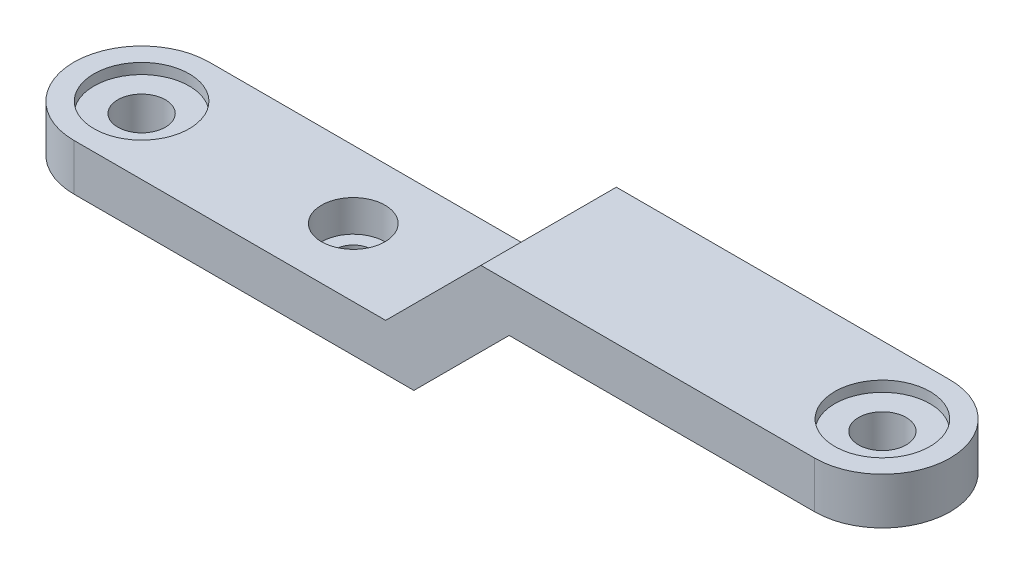
ISO-10303-21;
HEADER;
FILE_DESCRIPTION(('STEP AP214'),'2;1');
FILE_NAME('part.step','',(''),(''),'','','');
FILE_SCHEMA(('AUTOMOTIVE_DESIGN { 1 0 10303 214 1 1 1 1 }'));
ENDSEC;
DATA;
#1=APPLICATION_CONTEXT('core data for automotive mechanical design processes');
#2=APPLICATION_PROTOCOL_DEFINITION('international standard','automotive_design',2000,#1);
#3=PRODUCT_CONTEXT('',#1,'mechanical');
#4=PRODUCT('Part','Part','',(#3));
#5=PRODUCT_RELATED_PRODUCT_CATEGORY('part','',(#4));
#6=PRODUCT_DEFINITION_FORMATION('','',#4);
#7=PRODUCT_DEFINITION_CONTEXT('part definition',#1,'design');
#8=PRODUCT_DEFINITION('design','',#6,#7);
#9=PRODUCT_DEFINITION_SHAPE('','',#8);
#10=(LENGTH_UNIT() NAMED_UNIT(*) SI_UNIT(.MILLI.,.METRE.));
#11=(NAMED_UNIT(*) PLANE_ANGLE_UNIT() SI_UNIT($,.RADIAN.));
#12=(NAMED_UNIT(*) SI_UNIT($,.STERADIAN.) SOLID_ANGLE_UNIT());
#13=UNCERTAINTY_MEASURE_WITH_UNIT(LENGTH_MEASURE(1.E-05),#10,'distance_accuracy_value','');
#14=(GEOMETRIC_REPRESENTATION_CONTEXT(3) GLOBAL_UNCERTAINTY_ASSIGNED_CONTEXT((#13)) GLOBAL_UNIT_ASSIGNED_CONTEXT((#10,
#11,#12)) REPRESENTATION_CONTEXT('',''));
#15=CARTESIAN_POINT('',(0.,0.,0.));
#16=DIRECTION('',(0.,0.,1.));
#17=DIRECTION('',(1.,0.,0.));
#18=AXIS2_PLACEMENT_3D('',#15,#16,#17);
#19=CARTESIAN_POINT('',(6.4,0.,0.));
#20=DIRECTION('',(0.,1.,0.));
#21=DIRECTION('',(-1.,0.,0.));
#22=AXIS2_PLACEMENT_3D('',#19,#20,#21);
#23=CYLINDRICAL_SURFACE('',#22,2.25);
#24=CARTESIAN_POINT('',(6.4,0.,0.));
#25=DIRECTION('',(0.,1.,0.));
#26=DIRECTION('',(-1.,0.,0.));
#27=AXIS2_PLACEMENT_3D('',#24,#25,#26);
#28=CIRCLE('',#27,2.25);
#29=CARTESIAN_POINT('',(4.15,0.,0.));
#30=VERTEX_POINT('',#29);
#31=EDGE_CURVE('E155',#30,#30,#28,.T.);
#32=ORIENTED_EDGE('',*,*,#31,.F.);
#33=EDGE_LOOP('',(#32));
#34=FACE_BOUND('',#33,.T.);
#35=CARTESIAN_POINT('',(6.4,3.4,0.));
#36=DIRECTION('',(0.,1.,0.));
#37=DIRECTION('',(-1.,0.,0.));
#38=AXIS2_PLACEMENT_3D('',#35,#36,#37);
#39=CIRCLE('',#38,2.25);
#40=CARTESIAN_POINT('',(4.15,3.4,0.));
#41=VERTEX_POINT('',#40);
#42=EDGE_CURVE('E157',#41,#41,#39,.F.);
#43=ORIENTED_EDGE('',*,*,#42,.F.);
#44=EDGE_LOOP('',(#43));
#45=FACE_BOUND('',#44,.T.);
#46=ADVANCED_FACE('F40',(#34,#45),#23,.F.);
#47=CARTESIAN_POINT('',(76.4,0.,0.));
#48=DIRECTION('',(0.,1.,0.));
#49=DIRECTION('',(-1.,0.,0.));
#50=AXIS2_PLACEMENT_3D('',#47,#48,#49);
#51=CYLINDRICAL_SURFACE('',#50,2.25);
#52=CARTESIAN_POINT('',(76.4,9.00000000000001,0.));
#53=DIRECTION('',(0.,1.,0.));
#54=DIRECTION('',(0.,0.,1.));
#55=AXIS2_PLACEMENT_3D('',#52,#53,#54);
#56=CIRCLE('',#55,2.25);
#57=CARTESIAN_POINT('',(76.4,9.00000000000001,2.25));
#58=VERTEX_POINT('',#57);
#59=EDGE_CURVE('E181',#58,#58,#56,.T.);
#60=ORIENTED_EDGE('',*,*,#59,.F.);
#61=EDGE_LOOP('',(#60));
#62=FACE_BOUND('',#61,.T.);
#63=CARTESIAN_POINT('',(76.4,12.4,0.));
#64=DIRECTION('',(0.,1.,0.));
#65=DIRECTION('',(-1.,0.,0.));
#66=AXIS2_PLACEMENT_3D('',#63,#64,#65);
#67=CIRCLE('',#66,2.25);
#68=CARTESIAN_POINT('',(74.15,12.4,0.));
#69=VERTEX_POINT('',#68);
#70=EDGE_CURVE('E153',#69,#69,#67,.F.);
#71=ORIENTED_EDGE('',*,*,#70,.F.);
#72=EDGE_LOOP('',(#71));
#73=FACE_BOUND('',#72,.T.);
#74=ADVANCED_FACE('F231',(#62,#73),#51,.F.);
#75=CARTESIAN_POINT('',(0.,0.,6.4));
#76=DIRECTION('',(0.,1.,0.));
#77=DIRECTION('',(0.,0.,1.));
#78=AXIS2_PLACEMENT_3D('',#75,#76,#77);
#79=PLANE('',#78);
#80=CARTESIAN_POINT('',(26.4,0.,0.));
#81=DIRECTION('',(0.,1.,0.));
#82=DIRECTION('',(-1.,0.,0.));
#83=AXIS2_PLACEMENT_3D('',#80,#81,#82);
#84=CIRCLE('',#83,1.75);
#85=CARTESIAN_POINT('',(24.65,0.,0.));
#86=VERTEX_POINT('',#85);
#87=EDGE_CURVE('E299',#86,#86,#84,.T.);
#88=ORIENTED_EDGE('',*,*,#87,.T.);
#89=EDGE_LOOP('',(#88));
#90=FACE_BOUND('',#89,.T.);
#91=ORIENTED_EDGE('',*,*,#31,.T.);
#92=EDGE_LOOP('',(#91));
#93=FACE_BOUND('',#92,.T.);
#94=CARTESIAN_POINT('',(6.4,0.,0.));
#95=DIRECTION('',(0.,1.,0.));
#96=DIRECTION('',(-1.,0.,0.));
#97=AXIS2_PLACEMENT_3D('',#94,#95,#96);
#98=CIRCLE('',#97,6.4);
#99=CARTESIAN_POINT('',(6.4,0.,-6.4));
#100=VERTEX_POINT('',#99);
#101=CARTESIAN_POINT('',(6.4,0.,6.4));
#102=VERTEX_POINT('',#101);
#103=EDGE_CURVE('E107',#100,#102,#98,.T.);
#104=ORIENTED_EDGE('',*,*,#103,.F.);
#105=DIRECTION('',(1.,0.,0.));
#106=VECTOR('',#105,1.);
#107=CARTESIAN_POINT('',(0.,0.,-6.4));
#108=LINE('',#107,#106);
#109=CARTESIAN_POINT('',(38.5310678118655,0.,-6.4));
#110=VERTEX_POINT('',#109);
#111=EDGE_CURVE('E118',#100,#110,#108,.T.);
#112=ORIENTED_EDGE('',*,*,#111,.T.);
#113=DIRECTION('',(0.,0.,-1.));
#114=VECTOR('',#113,1.);
#115=CARTESIAN_POINT('',(38.5310678118655,0.,6.4));
#116=LINE('',#115,#114);
#117=CARTESIAN_POINT('',(38.5310678118655,0.,6.4));
#118=VERTEX_POINT('',#117);
#119=EDGE_CURVE('E49',#118,#110,#116,.T.);
#120=ORIENTED_EDGE('',*,*,#119,.F.);
#121=DIRECTION('',(1.,0.,0.));
#122=VECTOR('',#121,1.);
#123=CARTESIAN_POINT('',(0.,0.,6.4));
#124=LINE('',#123,#122);
#125=EDGE_CURVE('E120',#102,#118,#124,.T.);
#126=ORIENTED_EDGE('',*,*,#125,.F.);
#127=EDGE_LOOP('',(#104,#112,#120,#126));
#128=FACE_BOUND('',#127,.T.);
#129=ADVANCED_FACE('F42',(#90,#93,#128),#79,.F.);
#130=CARTESIAN_POINT('',(47.5310678118654,9.00000000000001,6.4));
#131=DIRECTION('',(0.,1.,0.));
#132=DIRECTION('',(0.,0.,1.));
#133=AXIS2_PLACEMENT_3D('',#130,#131,#132);
#134=PLANE('',#133);
#135=ORIENTED_EDGE('',*,*,#59,.T.);
#136=EDGE_LOOP('',(#135));
#137=FACE_BOUND('',#136,.T.);
#138=CARTESIAN_POINT('',(76.4,9.00000000000001,0.));
#139=DIRECTION('',(0.,1.,0.));
#140=DIRECTION('',(0.,0.,1.));
#141=AXIS2_PLACEMENT_3D('',#138,#139,#140);
#142=CIRCLE('',#141,6.4);
#143=CARTESIAN_POINT('',(76.4,9.00000000000001,6.4));
#144=VERTEX_POINT('',#143);
#145=CARTESIAN_POINT('',(76.4,9.00000000000001,-6.4));
#146=VERTEX_POINT('',#145);
#147=EDGE_CURVE('E56',#144,#146,#142,.T.);
#148=ORIENTED_EDGE('',*,*,#147,.F.);
#149=DIRECTION('',(1.,0.,0.));
#150=VECTOR('',#149,1.);
#151=CARTESIAN_POINT('',(47.5310678118654,9.00000000000001,6.4));
#152=LINE('',#151,#150);
#153=CARTESIAN_POINT('',(47.5310678118654,9.00000000000001,6.4));
#154=VERTEX_POINT('',#153);
#155=EDGE_CURVE('E193',#154,#144,#152,.T.);
#156=ORIENTED_EDGE('',*,*,#155,.F.);
#157=DIRECTION('',(0.,0.,-1.));
#158=VECTOR('',#157,1.);
#159=CARTESIAN_POINT('',(47.5310678118654,9.00000000000001,6.4));
#160=LINE('',#159,#158);
#161=CARTESIAN_POINT('',(47.5310678118654,9.00000000000001,-6.4));
#162=VERTEX_POINT('',#161);
#163=EDGE_CURVE('E149',#154,#162,#160,.T.);
#164=ORIENTED_EDGE('',*,*,#163,.T.);
#165=DIRECTION('',(1.,0.,0.));
#166=VECTOR('',#165,1.);
#167=CARTESIAN_POINT('',(47.5310678118654,9.00000000000001,-6.4));
#168=LINE('',#167,#166);
#169=EDGE_CURVE('E128',#162,#146,#168,.T.);
#170=ORIENTED_EDGE('',*,*,#169,.T.);
#171=EDGE_LOOP('',(#148,#156,#164,#170));
#172=FACE_BOUND('',#171,.T.);
#173=ADVANCED_FACE('F216',(#137,#172),#134,.F.);
#174=CARTESIAN_POINT('',(82.8,13.4,6.4));
#175=DIRECTION('',(0.,-1.,0.));
#176=DIRECTION('',(1.,0.,0.));
#177=AXIS2_PLACEMENT_3D('',#174,#175,#176);
#178=PLANE('',#177);
#179=CARTESIAN_POINT('',(76.4,13.4,0.));
#180=DIRECTION('',(0.,1.,0.));
#181=DIRECTION('',(-1.,0.,0.));
#182=AXIS2_PLACEMENT_3D('',#179,#180,#181);
#183=CIRCLE('',#182,4.5);
#184=CARTESIAN_POINT('',(71.9,13.4,0.));
#185=VERTEX_POINT('',#184);
#186=EDGE_CURVE('E159',#185,#185,#183,.T.);
#187=ORIENTED_EDGE('',*,*,#186,.F.);
#188=EDGE_LOOP('',(#187));
#189=FACE_BOUND('',#188,.T.);
#190=CARTESIAN_POINT('',(76.4,13.4,0.));
#191=DIRECTION('',(0.,1.,0.));
#192=DIRECTION('',(-1.,0.,0.));
#193=AXIS2_PLACEMENT_3D('',#190,#191,#192);
#194=CIRCLE('',#193,6.4);
#195=CARTESIAN_POINT('',(76.4,13.4,6.4));
#196=VERTEX_POINT('',#195);
#197=CARTESIAN_POINT('',(76.4,13.4,-6.4));
#198=VERTEX_POINT('',#197);
#199=EDGE_CURVE('E121',#196,#198,#194,.T.);
#200=ORIENTED_EDGE('',*,*,#199,.T.);
#201=DIRECTION('',(-1.,0.,0.));
#202=VECTOR('',#201,1.);
#203=CARTESIAN_POINT('',(82.8,13.4,-6.4));
#204=LINE('',#203,#202);
#205=CARTESIAN_POINT('',(44.86,13.4,-6.4));
#206=VERTEX_POINT('',#205);
#207=EDGE_CURVE('E137',#198,#206,#204,.T.);
#208=ORIENTED_EDGE('',*,*,#207,.T.);
#209=DIRECTION('',(0.,0.,-1.));
#210=VECTOR('',#209,1.);
#211=CARTESIAN_POINT('',(44.86,13.4,6.4));
#212=LINE('',#211,#210);
#213=CARTESIAN_POINT('',(44.86,13.4,6.4));
#214=VERTEX_POINT('',#213);
#215=EDGE_CURVE('E146',#214,#206,#212,.T.);
#216=ORIENTED_EDGE('',*,*,#215,.F.);
#217=DIRECTION('',(-1.,0.,0.));
#218=VECTOR('',#217,1.);
#219=CARTESIAN_POINT('',(82.8,13.4,6.4));
#220=LINE('',#219,#218);
#221=EDGE_CURVE('E196',#196,#214,#220,.T.);
#222=ORIENTED_EDGE('',*,*,#221,.F.);
#223=EDGE_LOOP('',(#200,#208,#216,#222));
#224=FACE_BOUND('',#223,.T.);
#225=ADVANCED_FACE('F213',(#189,#224),#178,.F.);
#226=CARTESIAN_POINT('',(35.86,4.4,6.4));
#227=DIRECTION('',(0.,-1.,0.));
#228=DIRECTION('',(1.,0.,0.));
#229=AXIS2_PLACEMENT_3D('',#226,#227,#228);
#230=PLANE('',#229);
#231=CARTESIAN_POINT('',(26.4,4.4,0.));
#232=DIRECTION('',(0.,1.,0.));
#233=DIRECTION('',(-1.,0.,0.));
#234=AXIS2_PLACEMENT_3D('',#231,#232,#233);
#235=CIRCLE('',#234,3.);
#236=CARTESIAN_POINT('',(23.4,4.4,0.));
#237=VERTEX_POINT('',#236);
#238=EDGE_CURVE('E174',#237,#237,#235,.T.);
#239=ORIENTED_EDGE('',*,*,#238,.F.);
#240=EDGE_LOOP('',(#239));
#241=FACE_BOUND('',#240,.T.);
#242=CARTESIAN_POINT('',(6.4,4.4,0.));
#243=DIRECTION('',(0.,1.,0.));
#244=DIRECTION('',(-1.,0.,0.));
#245=AXIS2_PLACEMENT_3D('',#242,#243,#244);
#246=CIRCLE('',#245,4.5);
#247=CARTESIAN_POINT('',(1.9,4.4,0.));
#248=VERTEX_POINT('',#247);
#249=EDGE_CURVE('E166',#248,#248,#246,.T.);
#250=ORIENTED_EDGE('',*,*,#249,.F.);
#251=EDGE_LOOP('',(#250));
#252=FACE_BOUND('',#251,.T.);
#253=CARTESIAN_POINT('',(6.4,4.4,0.));
#254=DIRECTION('',(0.,-1.,0.));
#255=DIRECTION('',(1.,0.,0.));
#256=AXIS2_PLACEMENT_3D('',#253,#254,#255);
#257=CIRCLE('',#256,6.4);
#258=CARTESIAN_POINT('',(6.4,4.4,6.4));
#259=VERTEX_POINT('',#258);
#260=CARTESIAN_POINT('',(6.4,4.4,-6.4));
#261=VERTEX_POINT('',#260);
#262=EDGE_CURVE('E64',#259,#261,#257,.T.);
#263=ORIENTED_EDGE('',*,*,#262,.F.);
#264=DIRECTION('',(-1.,0.,0.));
#265=VECTOR('',#264,1.);
#266=CARTESIAN_POINT('',(35.86,4.4,6.4));
#267=LINE('',#266,#265);
#268=CARTESIAN_POINT('',(35.86,4.4,6.4));
#269=VERTEX_POINT('',#268);
#270=EDGE_CURVE('E132',#269,#259,#267,.T.);
#271=ORIENTED_EDGE('',*,*,#270,.F.);
#272=DIRECTION('',(0.,0.,-1.));
#273=VECTOR('',#272,1.);
#274=CARTESIAN_POINT('',(35.86,4.4,6.4));
#275=LINE('',#274,#273);
#276=CARTESIAN_POINT('',(35.86,4.4,-6.4));
#277=VERTEX_POINT('',#276);
#278=EDGE_CURVE('E143',#269,#277,#275,.T.);
#279=ORIENTED_EDGE('',*,*,#278,.T.);
#280=DIRECTION('',(-1.,0.,0.));
#281=VECTOR('',#280,1.);
#282=CARTESIAN_POINT('',(35.86,4.4,-6.4));
#283=LINE('',#282,#281);
#284=EDGE_CURVE('E141',#277,#261,#283,.T.);
#285=ORIENTED_EDGE('',*,*,#284,.T.);
#286=EDGE_LOOP('',(#263,#271,#279,#285));
#287=FACE_BOUND('',#286,.T.);
#288=ADVANCED_FACE('F205',(#241,#252,#287),#230,.F.);
#289=CARTESIAN_POINT('',(0.,0.,6.4));
#290=DIRECTION('',(0.,0.,1.));
#291=DIRECTION('',(1.,0.,0.));
#292=AXIS2_PLACEMENT_3D('',#289,#290,#291);
#293=PLANE('',#292);
#294=ORIENTED_EDGE('',*,*,#155,.T.);
#295=DIRECTION('',(0.,1.,0.));
#296=VECTOR('',#295,1.);
#297=CARTESIAN_POINT('',(76.4,0.,6.4));
#298=LINE('',#297,#296);
#299=EDGE_CURVE('E185',#144,#196,#298,.T.);
#300=ORIENTED_EDGE('',*,*,#299,.T.);
#301=ORIENTED_EDGE('',*,*,#221,.T.);
#302=DIRECTION('',(-0.707106781186546,-0.707106781186549,0.));
#303=VECTOR('',#302,1.);
#304=CARTESIAN_POINT('',(44.86,13.4,6.4));
#305=LINE('',#304,#303);
#306=EDGE_CURVE('E197',#214,#269,#305,.T.);
#307=ORIENTED_EDGE('',*,*,#306,.T.);
#308=ORIENTED_EDGE('',*,*,#270,.T.);
#309=DIRECTION('',(0.,1.,0.));
#310=VECTOR('',#309,1.);
#311=CARTESIAN_POINT('',(6.4,0.,6.4));
#312=LINE('',#311,#310);
#313=EDGE_CURVE('E113',#102,#259,#312,.T.);
#314=ORIENTED_EDGE('',*,*,#313,.F.);
#315=ORIENTED_EDGE('',*,*,#125,.T.);
#316=DIRECTION('',(0.707106781186546,0.707106781186549,0.));
#317=VECTOR('',#316,1.);
#318=CARTESIAN_POINT('',(38.5310678118655,0.,6.4));
#319=LINE('',#318,#317);
#320=EDGE_CURVE('E191',#118,#154,#319,.T.);
#321=ORIENTED_EDGE('',*,*,#320,.T.);
#322=EDGE_LOOP('',(#294,#300,#301,#307,#308,#314,#315,#321));
#323=FACE_BOUND('',#322,.T.);
#324=ADVANCED_FACE('F203',(#323),#293,.T.);
#325=CARTESIAN_POINT('',(0.,0.,-6.4));
#326=DIRECTION('',(0.,0.,1.));
#327=DIRECTION('',(1.,0.,0.));
#328=AXIS2_PLACEMENT_3D('',#325,#326,#327);
#329=PLANE('',#328);
#330=DIRECTION('',(0.,1.,0.));
#331=VECTOR('',#330,1.);
#332=CARTESIAN_POINT('',(76.4,0.,-6.4));
#333=LINE('',#332,#331);
#334=EDGE_CURVE('E12',#146,#198,#333,.T.);
#335=ORIENTED_EDGE('',*,*,#334,.F.);
#336=ORIENTED_EDGE('',*,*,#169,.F.);
#337=DIRECTION('',(0.707106781186546,0.707106781186549,0.));
#338=VECTOR('',#337,1.);
#339=CARTESIAN_POINT('',(38.5310678118655,0.,-6.4));
#340=LINE('',#339,#338);
#341=EDGE_CURVE('E126',#110,#162,#340,.T.);
#342=ORIENTED_EDGE('',*,*,#341,.F.);
#343=ORIENTED_EDGE('',*,*,#111,.F.);
#344=DIRECTION('',(0.,1.,0.));
#345=VECTOR('',#344,1.);
#346=CARTESIAN_POINT('',(6.4,0.,-6.4));
#347=LINE('',#346,#345);
#348=EDGE_CURVE('E104',#100,#261,#347,.T.);
#349=ORIENTED_EDGE('',*,*,#348,.T.);
#350=ORIENTED_EDGE('',*,*,#284,.F.);
#351=DIRECTION('',(-0.707106781186546,-0.707106781186549,0.));
#352=VECTOR('',#351,1.);
#353=CARTESIAN_POINT('',(44.86,13.4,-6.4));
#354=LINE('',#353,#352);
#355=EDGE_CURVE('E139',#206,#277,#354,.T.);
#356=ORIENTED_EDGE('',*,*,#355,.F.);
#357=ORIENTED_EDGE('',*,*,#207,.F.);
#358=EDGE_LOOP('',(#335,#336,#342,#343,#349,#350,#356,#357));
#359=FACE_BOUND('',#358,.T.);
#360=ADVANCED_FACE('F124',(#359),#329,.F.);
#361=CARTESIAN_POINT('',(38.5310678118655,0.,6.4));
#362=DIRECTION('',(-0.707106781186549,0.707106781186546,0.));
#363=DIRECTION('',(-0.707106781186546,-0.707106781186549,0.));
#364=AXIS2_PLACEMENT_3D('',#361,#362,#363);
#365=PLANE('',#364);
#366=ORIENTED_EDGE('',*,*,#341,.T.);
#367=ORIENTED_EDGE('',*,*,#163,.F.);
#368=ORIENTED_EDGE('',*,*,#320,.F.);
#369=ORIENTED_EDGE('',*,*,#119,.T.);
#370=EDGE_LOOP('',(#366,#367,#368,#369));
#371=FACE_BOUND('',#370,.T.);
#372=ADVANCED_FACE('F221',(#371),#365,.F.);
#373=CARTESIAN_POINT('',(44.86,13.4,6.4));
#374=DIRECTION('',(0.707106781186549,-0.707106781186546,0.));
#375=DIRECTION('',(0.707106781186546,0.707106781186549,0.));
#376=AXIS2_PLACEMENT_3D('',#373,#374,#375);
#377=PLANE('',#376);
#378=ORIENTED_EDGE('',*,*,#355,.T.);
#379=ORIENTED_EDGE('',*,*,#278,.F.);
#380=ORIENTED_EDGE('',*,*,#306,.F.);
#381=ORIENTED_EDGE('',*,*,#215,.T.);
#382=EDGE_LOOP('',(#378,#379,#380,#381));
#383=FACE_BOUND('',#382,.T.);
#384=ADVANCED_FACE('F209',(#383),#377,.F.);
#385=CARTESIAN_POINT('',(6.4,0.,0.));
#386=DIRECTION('',(0.,1.,0.));
#387=DIRECTION('',(-1.,0.,0.));
#388=AXIS2_PLACEMENT_3D('',#385,#386,#387);
#389=CYLINDRICAL_SURFACE('',#388,6.4);
#390=ORIENTED_EDGE('',*,*,#103,.T.);
#391=ORIENTED_EDGE('',*,*,#313,.T.);
#392=ORIENTED_EDGE('',*,*,#262,.T.);
#393=ORIENTED_EDGE('',*,*,#348,.F.);
#394=EDGE_LOOP('',(#390,#391,#392,#393));
#395=FACE_BOUND('',#394,.T.);
#396=ADVANCED_FACE('F106',(#395),#389,.T.);
#397=CARTESIAN_POINT('',(76.4,0.,0.));
#398=DIRECTION('',(0.,1.,0.));
#399=DIRECTION('',(-1.,0.,0.));
#400=AXIS2_PLACEMENT_3D('',#397,#398,#399);
#401=CYLINDRICAL_SURFACE('',#400,6.4);
#402=ORIENTED_EDGE('',*,*,#147,.T.);
#403=ORIENTED_EDGE('',*,*,#334,.T.);
#404=ORIENTED_EDGE('',*,*,#199,.F.);
#405=ORIENTED_EDGE('',*,*,#299,.F.);
#406=EDGE_LOOP('',(#402,#403,#404,#405));
#407=FACE_BOUND('',#406,.T.);
#408=ADVANCED_FACE('F214',(#407),#401,.T.);
#409=CARTESIAN_POINT('',(76.4,12.4,0.));
#410=DIRECTION('',(0.,1.,0.));
#411=DIRECTION('',(-1.,0.,0.));
#412=AXIS2_PLACEMENT_3D('',#409,#410,#411);
#413=PLANE('',#412);
#414=CARTESIAN_POINT('',(76.4,12.4,0.));
#415=DIRECTION('',(0.,1.,0.));
#416=DIRECTION('',(-1.,0.,0.));
#417=AXIS2_PLACEMENT_3D('',#414,#415,#416);
#418=CIRCLE('',#417,4.5);
#419=CARTESIAN_POINT('',(71.9,12.4,0.));
#420=VERTEX_POINT('',#419);
#421=EDGE_CURVE('E156',#420,#420,#418,.T.);
#422=ORIENTED_EDGE('',*,*,#421,.T.);
#423=EDGE_LOOP('',(#422));
#424=FACE_BOUND('',#423,.T.);
#425=ORIENTED_EDGE('',*,*,#70,.T.);
#426=EDGE_LOOP('',(#425));
#427=FACE_BOUND('',#426,.T.);
#428=ADVANCED_FACE('F247',(#424,#427),#413,.T.);
#429=CARTESIAN_POINT('',(76.4,12.4,0.));
#430=DIRECTION('',(0.,1.,0.));
#431=DIRECTION('',(-1.,0.,0.));
#432=AXIS2_PLACEMENT_3D('',#429,#430,#431);
#433=CYLINDRICAL_SURFACE('',#432,4.5);
#434=ORIENTED_EDGE('',*,*,#421,.F.);
#435=EDGE_LOOP('',(#434));
#436=FACE_BOUND('',#435,.T.);
#437=ORIENTED_EDGE('',*,*,#186,.T.);
#438=EDGE_LOOP('',(#437));
#439=FACE_BOUND('',#438,.T.);
#440=ADVANCED_FACE('F242',(#436,#439),#433,.F.);
#441=CARTESIAN_POINT('',(6.4,3.4,0.));
#442=DIRECTION('',(0.,1.,0.));
#443=DIRECTION('',(-1.,0.,0.));
#444=AXIS2_PLACEMENT_3D('',#441,#442,#443);
#445=PLANE('',#444);
#446=CARTESIAN_POINT('',(6.4,3.4,0.));
#447=DIRECTION('',(0.,1.,0.));
#448=DIRECTION('',(-1.,0.,0.));
#449=AXIS2_PLACEMENT_3D('',#446,#447,#448);
#450=CIRCLE('',#449,4.5);
#451=CARTESIAN_POINT('',(1.9,3.4,0.));
#452=VERTEX_POINT('',#451);
#453=EDGE_CURVE('E160',#452,#452,#450,.T.);
#454=ORIENTED_EDGE('',*,*,#453,.T.);
#455=EDGE_LOOP('',(#454));
#456=FACE_BOUND('',#455,.T.);
#457=ORIENTED_EDGE('',*,*,#42,.T.);
#458=EDGE_LOOP('',(#457));
#459=FACE_BOUND('',#458,.T.);
#460=ADVANCED_FACE('F272',(#456,#459),#445,.T.);
#461=CARTESIAN_POINT('',(6.4,3.4,0.));
#462=DIRECTION('',(0.,1.,0.));
#463=DIRECTION('',(-1.,0.,0.));
#464=AXIS2_PLACEMENT_3D('',#461,#462,#463);
#465=CYLINDRICAL_SURFACE('',#464,4.5);
#466=ORIENTED_EDGE('',*,*,#453,.F.);
#467=EDGE_LOOP('',(#466));
#468=FACE_BOUND('',#467,.T.);
#469=ORIENTED_EDGE('',*,*,#249,.T.);
#470=EDGE_LOOP('',(#469));
#471=FACE_BOUND('',#470,.T.);
#472=ADVANCED_FACE('F275',(#468,#471),#465,.F.);
#473=CARTESIAN_POINT('',(26.4,1.4,0.));
#474=DIRECTION('',(0.,1.,0.));
#475=DIRECTION('',(-1.,0.,0.));
#476=AXIS2_PLACEMENT_3D('',#473,#474,#475);
#477=CYLINDRICAL_SURFACE('',#476,3.);
#478=CARTESIAN_POINT('',(26.4,1.4,0.));
#479=DIRECTION('',(0.,1.,0.));
#480=DIRECTION('',(-1.,0.,0.));
#481=AXIS2_PLACEMENT_3D('',#478,#479,#480);
#482=CIRCLE('',#481,3.);
#483=CARTESIAN_POINT('',(23.4,1.4,0.));
#484=VERTEX_POINT('',#483);
#485=EDGE_CURVE('E171',#484,#484,#482,.T.);
#486=ORIENTED_EDGE('',*,*,#485,.F.);
#487=EDGE_LOOP('',(#486));
#488=FACE_BOUND('',#487,.T.);
#489=ORIENTED_EDGE('',*,*,#238,.T.);
#490=EDGE_LOOP('',(#489));
#491=FACE_BOUND('',#490,.T.);
#492=ADVANCED_FACE('F278',(#488,#491),#477,.F.);
#493=CARTESIAN_POINT('',(26.4,1.4,0.));
#494=DIRECTION('',(0.,1.,0.));
#495=DIRECTION('',(-1.,0.,0.));
#496=AXIS2_PLACEMENT_3D('',#493,#494,#495);
#497=PLANE('',#496);
#498=CARTESIAN_POINT('',(26.4,1.4,0.));
#499=DIRECTION('',(0.,1.,0.));
#500=DIRECTION('',(-1.,0.,0.));
#501=AXIS2_PLACEMENT_3D('',#498,#499,#500);
#502=CIRCLE('',#501,1.75);
#503=CARTESIAN_POINT('',(24.65,1.4,0.));
#504=VERTEX_POINT('',#503);
#505=EDGE_CURVE('E44',#504,#504,#502,.T.);
#506=ORIENTED_EDGE('',*,*,#505,.F.);
#507=EDGE_LOOP('',(#506));
#508=FACE_BOUND('',#507,.T.);
#509=ORIENTED_EDGE('',*,*,#485,.T.);
#510=EDGE_LOOP('',(#509));
#511=FACE_BOUND('',#510,.T.);
#512=ADVANCED_FACE('F284',(#508,#511),#497,.T.);
#513=CARTESIAN_POINT('',(26.4,0.,0.));
#514=DIRECTION('',(0.,1.,0.));
#515=DIRECTION('',(-1.,0.,0.));
#516=AXIS2_PLACEMENT_3D('',#513,#514,#515);
#517=CYLINDRICAL_SURFACE('',#516,1.75);
#518=ORIENTED_EDGE('',*,*,#505,.T.);
#519=EDGE_LOOP('',(#518));
#520=FACE_BOUND('',#519,.T.);
#521=ORIENTED_EDGE('',*,*,#87,.F.);
#522=EDGE_LOOP('',(#521));
#523=FACE_BOUND('',#522,.T.);
#524=ADVANCED_FACE('F288',(#520,#523),#517,.F.);
#525=CLOSED_SHELL('',(#46,#74,#129,#173,#225,#288,#324,#360,#372,#384,#396,#408,#428,#440,#460,
#472,#492,#512,#524));
#526=MANIFOLD_SOLID_BREP('B2',#525);
#527=ADVANCED_BREP_SHAPE_REPRESENTATION('',(#18,#526),#14);
#528=SHAPE_DEFINITION_REPRESENTATION(#9,#527);
ENDSEC;
END-ISO-10303-21;
